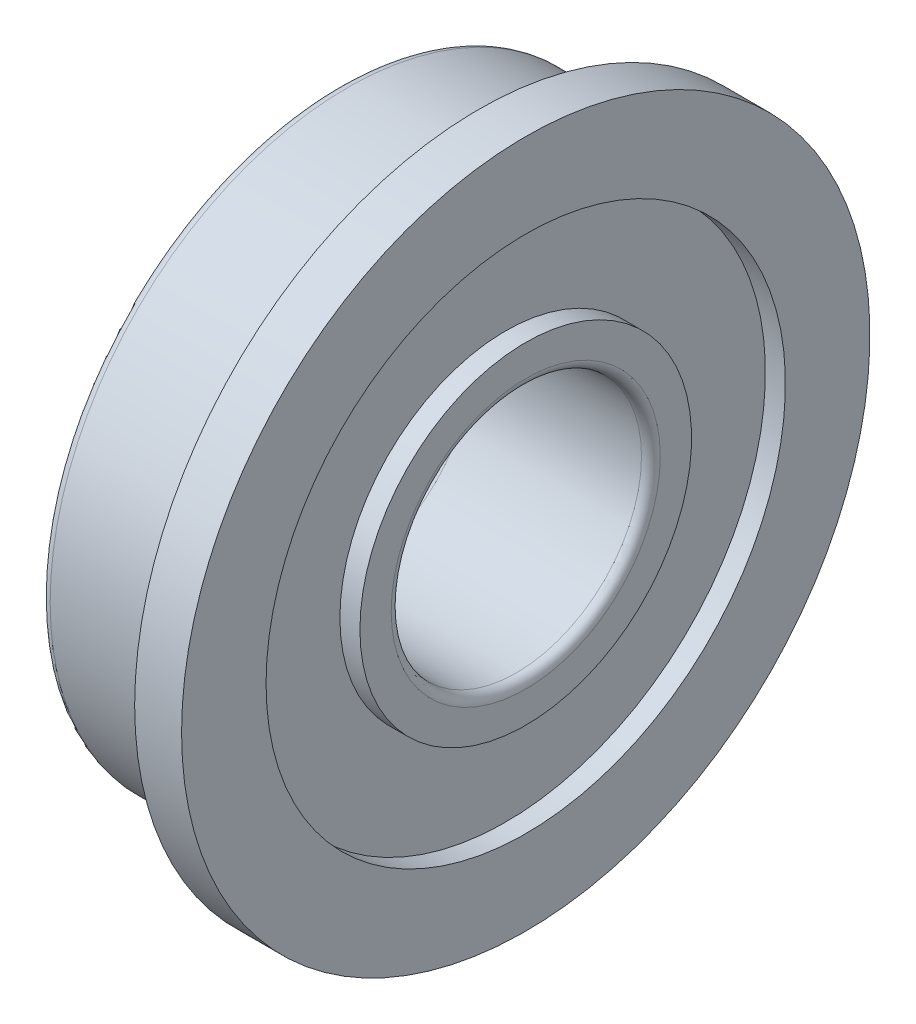
ISO-10303-21;
HEADER;
FILE_DESCRIPTION(('STEP AP214'),'2;1');
FILE_NAME('part.step','',(''),(''),'','','');
FILE_SCHEMA(('AUTOMOTIVE_DESIGN { 1 0 10303 214 1 1 1 1 }'));
ENDSEC;
DATA;
#1=APPLICATION_CONTEXT('core data for automotive mechanical design processes');
#2=APPLICATION_PROTOCOL_DEFINITION('international standard','automotive_design',2000,#1);
#3=PRODUCT_CONTEXT('',#1,'mechanical');
#4=PRODUCT('Part','Part','',(#3));
#5=PRODUCT_RELATED_PRODUCT_CATEGORY('part','',(#4));
#6=PRODUCT_DEFINITION_FORMATION('','',#4);
#7=PRODUCT_DEFINITION_CONTEXT('part definition',#1,'design');
#8=PRODUCT_DEFINITION('design','',#6,#7);
#9=PRODUCT_DEFINITION_SHAPE('','',#8);
#10=(LENGTH_UNIT() NAMED_UNIT(*) SI_UNIT(.MILLI.,.METRE.));
#11=(NAMED_UNIT(*) PLANE_ANGLE_UNIT() SI_UNIT($,.RADIAN.));
#12=(NAMED_UNIT(*) SI_UNIT($,.STERADIAN.) SOLID_ANGLE_UNIT());
#13=UNCERTAINTY_MEASURE_WITH_UNIT(LENGTH_MEASURE(1.E-05),#10,'distance_accuracy_value','');
#14=(GEOMETRIC_REPRESENTATION_CONTEXT(3) GLOBAL_UNCERTAINTY_ASSIGNED_CONTEXT((#13)) GLOBAL_UNIT_ASSIGNED_CONTEXT((#10,
#11,#12)) REPRESENTATION_CONTEXT('',''));
#15=CARTESIAN_POINT('',(0.,0.,0.));
#16=DIRECTION('',(0.,0.,1.));
#17=DIRECTION('',(1.,0.,0.));
#18=AXIS2_PLACEMENT_3D('',#15,#16,#17);
#19=CARTESIAN_POINT('',(0.299999999999936,0.,0.));
#20=DIRECTION('',(-1.,0.,0.));
#21=DIRECTION('',(0.,0.,1.));
#22=AXIS2_PLACEMENT_3D('',#19,#20,#21);
#23=TOROIDAL_SURFACE('',#22,9.20000000000006,0.299999999999936);
#24=CARTESIAN_POINT('',(0.,0.,0.));
#25=DIRECTION('',(-1.,0.,0.));
#26=DIRECTION('',(0.,0.,1.));
#27=AXIS2_PLACEMENT_3D('',#24,#25,#26);
#28=CIRCLE('',#27,9.2);
#29=CARTESIAN_POINT('',(0.,0.,9.2));
#30=VERTEX_POINT('',#29);
#31=EDGE_CURVE('E10',#30,#30,#28,.T.);
#32=ORIENTED_EDGE('',*,*,#31,.F.);
#33=EDGE_LOOP('',(#32));
#34=FACE_BOUND('',#33,.T.);
#35=CARTESIAN_POINT('',(0.300000000000002,0.,0.));
#36=DIRECTION('',(-1.,0.,0.));
#37=DIRECTION('',(0.,0.,1.));
#38=AXIS2_PLACEMENT_3D('',#35,#36,#37);
#39=CIRCLE('',#38,9.5);
#40=CARTESIAN_POINT('',(0.300000000000002,0.,9.5));
#41=VERTEX_POINT('',#40);
#42=EDGE_CURVE('E88',#41,#41,#39,.T.);
#43=ORIENTED_EDGE('',*,*,#42,.T.);
#44=EDGE_LOOP('',(#43));
#45=FACE_BOUND('',#44,.T.);
#46=ADVANCED_FACE('F30',(#34,#45),#23,.T.);
#47=CARTESIAN_POINT('',(0.,9.2,0.));
#48=DIRECTION('',(1.,0.,0.));
#49=DIRECTION('',(0.,0.,-1.));
#50=AXIS2_PLACEMENT_3D('',#47,#48,#49);
#51=PLANE('',#50);
#52=CARTESIAN_POINT('',(0.,0.,0.));
#53=DIRECTION('',(-1.,0.,0.));
#54=DIRECTION('',(0.,0.,1.));
#55=AXIS2_PLACEMENT_3D('',#52,#53,#54);
#56=CIRCLE('',#55,8.3);
#57=CARTESIAN_POINT('',(0.,0.,8.3));
#58=VERTEX_POINT('',#57);
#59=EDGE_CURVE('E36',#58,#58,#56,.T.);
#60=ORIENTED_EDGE('',*,*,#59,.F.);
#61=EDGE_LOOP('',(#60));
#62=FACE_BOUND('',#61,.T.);
#63=ORIENTED_EDGE('',*,*,#31,.T.);
#64=EDGE_LOOP('',(#63));
#65=FACE_BOUND('',#64,.T.);
#66=ADVANCED_FACE('F185',(#62,#65),#51,.F.);
#67=CARTESIAN_POINT('',(19.,0.,0.));
#68=DIRECTION('',(-1.,0.,0.));
#69=DIRECTION('',(0.,0.,1.));
#70=AXIS2_PLACEMENT_3D('',#67,#68,#69);
#71=CYLINDRICAL_SURFACE('',#70,8.3);
#72=CARTESIAN_POINT('',(0.640000000000002,0.,0.));
#73=DIRECTION('',(-1.,0.,0.));
#74=DIRECTION('',(0.,0.,1.));
#75=AXIS2_PLACEMENT_3D('',#72,#73,#74);
#76=CIRCLE('',#75,8.3);
#77=CARTESIAN_POINT('',(0.640000000000002,0.,8.3));
#78=VERTEX_POINT('',#77);
#79=EDGE_CURVE('E40',#78,#78,#76,.T.);
#80=ORIENTED_EDGE('',*,*,#79,.F.);
#81=EDGE_LOOP('',(#80));
#82=FACE_BOUND('',#81,.T.);
#83=ORIENTED_EDGE('',*,*,#59,.T.);
#84=EDGE_LOOP('',(#83));
#85=FACE_BOUND('',#84,.T.);
#86=ADVANCED_FACE('F180',(#82,#85),#71,.F.);
#87=CARTESIAN_POINT('',(0.64,8.3,0.));
#88=DIRECTION('',(1.,0.,0.));
#89=DIRECTION('',(0.,0.,-1.));
#90=AXIS2_PLACEMENT_3D('',#87,#88,#89);
#91=PLANE('',#90);
#92=CARTESIAN_POINT('',(0.640000000000002,0.,0.));
#93=DIRECTION('',(-1.,0.,0.));
#94=DIRECTION('',(0.,0.,1.));
#95=AXIS2_PLACEMENT_3D('',#92,#93,#94);
#96=CIRCLE('',#95,5.3);
#97=CARTESIAN_POINT('',(0.640000000000002,0.,5.3));
#98=VERTEX_POINT('',#97);
#99=EDGE_CURVE('E44',#98,#98,#96,.T.);
#100=ORIENTED_EDGE('',*,*,#99,.F.);
#101=EDGE_LOOP('',(#100));
#102=FACE_BOUND('',#101,.T.);
#103=ORIENTED_EDGE('',*,*,#79,.T.);
#104=EDGE_LOOP('',(#103));
#105=FACE_BOUND('',#104,.T.);
#106=ADVANCED_FACE('F174',(#102,#105),#91,.F.);
#107=CARTESIAN_POINT('',(19.,0.,0.));
#108=DIRECTION('',(-1.,0.,0.));
#109=DIRECTION('',(0.,0.,1.));
#110=AXIS2_PLACEMENT_3D('',#107,#108,#109);
#111=CYLINDRICAL_SURFACE('',#110,5.3);
#112=CARTESIAN_POINT('',(0.,0.,0.));
#113=DIRECTION('',(-1.,0.,0.));
#114=DIRECTION('',(0.,0.,1.));
#115=AXIS2_PLACEMENT_3D('',#112,#113,#114);
#116=CIRCLE('',#115,5.3);
#117=CARTESIAN_POINT('',(0.,0.,5.3));
#118=VERTEX_POINT('',#117);
#119=EDGE_CURVE('E49',#118,#118,#116,.T.);
#120=ORIENTED_EDGE('',*,*,#119,.F.);
#121=EDGE_LOOP('',(#120));
#122=FACE_BOUND('',#121,.T.);
#123=ORIENTED_EDGE('',*,*,#99,.T.);
#124=EDGE_LOOP('',(#123));
#125=FACE_BOUND('',#124,.T.);
#126=ADVANCED_FACE('F168',(#122,#125),#111,.T.);
#127=CARTESIAN_POINT('',(0.,5.3,0.));
#128=DIRECTION('',(1.,0.,0.));
#129=DIRECTION('',(0.,0.,-1.));
#130=AXIS2_PLACEMENT_3D('',#127,#128,#129);
#131=PLANE('',#130);
#132=CARTESIAN_POINT('',(0.,0.,0.));
#133=DIRECTION('',(-1.,0.,0.));
#134=DIRECTION('',(0.,0.,1.));
#135=AXIS2_PLACEMENT_3D('',#132,#133,#134);
#136=CIRCLE('',#135,4.3);
#137=CARTESIAN_POINT('',(0.,0.,4.3));
#138=VERTEX_POINT('',#137);
#139=EDGE_CURVE('E52',#138,#138,#136,.T.);
#140=ORIENTED_EDGE('',*,*,#139,.F.);
#141=EDGE_LOOP('',(#140));
#142=FACE_BOUND('',#141,.T.);
#143=ORIENTED_EDGE('',*,*,#119,.T.);
#144=EDGE_LOOP('',(#143));
#145=FACE_BOUND('',#144,.T.);
#146=ADVANCED_FACE('F162',(#142,#145),#131,.F.);
#147=CARTESIAN_POINT('',(0.299999999999938,0.,0.));
#148=DIRECTION('',(-1.,0.,0.));
#149=DIRECTION('',(0.,0.,1.));
#150=AXIS2_PLACEMENT_3D('',#147,#148,#149);
#151=TOROIDAL_SURFACE('',#150,4.29999999999994,0.299999999999938);
#152=CARTESIAN_POINT('',(0.300000000000002,0.,0.));
#153=DIRECTION('',(-1.,0.,0.));
#154=DIRECTION('',(0.,0.,1.));
#155=AXIS2_PLACEMENT_3D('',#152,#153,#154);
#156=CIRCLE('',#155,4.);
#157=CARTESIAN_POINT('',(0.300000000000002,0.,4.));
#158=VERTEX_POINT('',#157);
#159=EDGE_CURVE('E55',#158,#158,#156,.T.);
#160=ORIENTED_EDGE('',*,*,#159,.F.);
#161=EDGE_LOOP('',(#160));
#162=FACE_BOUND('',#161,.T.);
#163=ORIENTED_EDGE('',*,*,#139,.T.);
#164=EDGE_LOOP('',(#163));
#165=FACE_BOUND('',#164,.T.);
#166=ADVANCED_FACE('F156',(#162,#165),#151,.T.);
#167=CARTESIAN_POINT('',(19.,0.,0.));
#168=DIRECTION('',(-1.,0.,0.));
#169=DIRECTION('',(0.,0.,1.));
#170=AXIS2_PLACEMENT_3D('',#167,#168,#169);
#171=CYLINDRICAL_SURFACE('',#170,4.);
#172=CARTESIAN_POINT('',(5.7,0.,0.));
#173=DIRECTION('',(-1.,0.,0.));
#174=DIRECTION('',(0.,0.,1.));
#175=AXIS2_PLACEMENT_3D('',#172,#173,#174);
#176=CIRCLE('',#175,4.);
#177=CARTESIAN_POINT('',(5.7,0.,4.));
#178=VERTEX_POINT('',#177);
#179=EDGE_CURVE('E58',#178,#178,#176,.T.);
#180=ORIENTED_EDGE('',*,*,#179,.F.);
#181=EDGE_LOOP('',(#180));
#182=FACE_BOUND('',#181,.T.);
#183=ORIENTED_EDGE('',*,*,#159,.T.);
#184=EDGE_LOOP('',(#183));
#185=FACE_BOUND('',#184,.T.);
#186=ADVANCED_FACE('F150',(#182,#185),#171,.F.);
#187=CARTESIAN_POINT('',(5.70000000000012,0.,0.));
#188=DIRECTION('',(-1.,0.,0.));
#189=DIRECTION('',(0.,0.,1.));
#190=AXIS2_PLACEMENT_3D('',#187,#188,#189);
#191=TOROIDAL_SURFACE('',#190,4.29999999999988,0.299999999999877);
#192=CARTESIAN_POINT('',(6.,0.,0.));
#193=DIRECTION('',(-1.,0.,0.));
#194=DIRECTION('',(0.,0.,1.));
#195=AXIS2_PLACEMENT_3D('',#192,#193,#194);
#196=CIRCLE('',#195,4.3);
#197=CARTESIAN_POINT('',(6.,0.,4.3));
#198=VERTEX_POINT('',#197);
#199=EDGE_CURVE('E61',#198,#198,#196,.T.);
#200=ORIENTED_EDGE('',*,*,#199,.F.);
#201=EDGE_LOOP('',(#200));
#202=FACE_BOUND('',#201,.T.);
#203=ORIENTED_EDGE('',*,*,#179,.T.);
#204=EDGE_LOOP('',(#203));
#205=FACE_BOUND('',#204,.T.);
#206=ADVANCED_FACE('F144',(#202,#205),#191,.T.);
#207=CARTESIAN_POINT('',(6.,4.3,0.));
#208=DIRECTION('',(-1.,0.,0.));
#209=DIRECTION('',(0.,0.,1.));
#210=AXIS2_PLACEMENT_3D('',#207,#208,#209);
#211=PLANE('',#210);
#212=CARTESIAN_POINT('',(6.,0.,0.));
#213=DIRECTION('',(-1.,0.,0.));
#214=DIRECTION('',(0.,0.,1.));
#215=AXIS2_PLACEMENT_3D('',#212,#213,#214);
#216=CIRCLE('',#215,5.3);
#217=CARTESIAN_POINT('',(6.,0.,5.3));
#218=VERTEX_POINT('',#217);
#219=EDGE_CURVE('E64',#218,#218,#216,.T.);
#220=ORIENTED_EDGE('',*,*,#219,.F.);
#221=EDGE_LOOP('',(#220));
#222=FACE_BOUND('',#221,.T.);
#223=ORIENTED_EDGE('',*,*,#199,.T.);
#224=EDGE_LOOP('',(#223));
#225=FACE_BOUND('',#224,.T.);
#226=ADVANCED_FACE('F138',(#222,#225),#211,.F.);
#227=CARTESIAN_POINT('',(19.,0.,0.));
#228=DIRECTION('',(-1.,0.,0.));
#229=DIRECTION('',(0.,0.,1.));
#230=AXIS2_PLACEMENT_3D('',#227,#228,#229);
#231=CYLINDRICAL_SURFACE('',#230,5.3);
#232=CARTESIAN_POINT('',(5.36,0.,0.));
#233=DIRECTION('',(-1.,0.,0.));
#234=DIRECTION('',(0.,0.,1.));
#235=AXIS2_PLACEMENT_3D('',#232,#233,#234);
#236=CIRCLE('',#235,5.3);
#237=CARTESIAN_POINT('',(5.36,0.,5.3));
#238=VERTEX_POINT('',#237);
#239=EDGE_CURVE('E67',#238,#238,#236,.T.);
#240=ORIENTED_EDGE('',*,*,#239,.F.);
#241=EDGE_LOOP('',(#240));
#242=FACE_BOUND('',#241,.T.);
#243=ORIENTED_EDGE('',*,*,#219,.T.);
#244=EDGE_LOOP('',(#243));
#245=FACE_BOUND('',#244,.T.);
#246=ADVANCED_FACE('F132',(#242,#245),#231,.T.);
#247=CARTESIAN_POINT('',(5.36,5.3,0.));
#248=DIRECTION('',(-1.,0.,0.));
#249=DIRECTION('',(0.,0.,1.));
#250=AXIS2_PLACEMENT_3D('',#247,#248,#249);
#251=PLANE('',#250);
#252=CARTESIAN_POINT('',(5.36,0.,0.));
#253=DIRECTION('',(-1.,0.,0.));
#254=DIRECTION('',(0.,0.,1.));
#255=AXIS2_PLACEMENT_3D('',#252,#253,#254);
#256=CIRCLE('',#255,8.3);
#257=CARTESIAN_POINT('',(5.36,0.,8.3));
#258=VERTEX_POINT('',#257);
#259=EDGE_CURVE('E70',#258,#258,#256,.T.);
#260=ORIENTED_EDGE('',*,*,#259,.F.);
#261=EDGE_LOOP('',(#260));
#262=FACE_BOUND('',#261,.T.);
#263=ORIENTED_EDGE('',*,*,#239,.T.);
#264=EDGE_LOOP('',(#263));
#265=FACE_BOUND('',#264,.T.);
#266=ADVANCED_FACE('F126',(#262,#265),#251,.F.);
#267=CARTESIAN_POINT('',(19.,0.,0.));
#268=DIRECTION('',(-1.,0.,0.));
#269=DIRECTION('',(0.,0.,1.));
#270=AXIS2_PLACEMENT_3D('',#267,#268,#269);
#271=CYLINDRICAL_SURFACE('',#270,8.3);
#272=CARTESIAN_POINT('',(6.,0.,0.));
#273=DIRECTION('',(-1.,0.,0.));
#274=DIRECTION('',(0.,0.,1.));
#275=AXIS2_PLACEMENT_3D('',#272,#273,#274);
#276=CIRCLE('',#275,8.3);
#277=CARTESIAN_POINT('',(6.,0.,8.3));
#278=VERTEX_POINT('',#277);
#279=EDGE_CURVE('E73',#278,#278,#276,.T.);
#280=ORIENTED_EDGE('',*,*,#279,.F.);
#281=EDGE_LOOP('',(#280));
#282=FACE_BOUND('',#281,.T.);
#283=ORIENTED_EDGE('',*,*,#259,.T.);
#284=EDGE_LOOP('',(#283));
#285=FACE_BOUND('',#284,.T.);
#286=ADVANCED_FACE('F120',(#282,#285),#271,.F.);
#287=CARTESIAN_POINT('',(6.,8.3,0.));
#288=DIRECTION('',(-1.,0.,0.));
#289=DIRECTION('',(0.,0.,1.));
#290=AXIS2_PLACEMENT_3D('',#287,#288,#289);
#291=PLANE('',#290);
#292=CARTESIAN_POINT('',(6.,0.,0.));
#293=DIRECTION('',(-1.,0.,0.));
#294=DIRECTION('',(0.,0.,1.));
#295=AXIS2_PLACEMENT_3D('',#292,#293,#294);
#296=CIRCLE('',#295,11.);
#297=CARTESIAN_POINT('',(6.,0.,11.));
#298=VERTEX_POINT('',#297);
#299=EDGE_CURVE('E76',#298,#298,#296,.T.);
#300=ORIENTED_EDGE('',*,*,#299,.F.);
#301=EDGE_LOOP('',(#300));
#302=FACE_BOUND('',#301,.T.);
#303=ORIENTED_EDGE('',*,*,#279,.T.);
#304=EDGE_LOOP('',(#303));
#305=FACE_BOUND('',#304,.T.);
#306=ADVANCED_FACE('F114',(#302,#305),#291,.F.);
#307=CARTESIAN_POINT('',(19.,0.,0.));
#308=DIRECTION('',(-1.,0.,0.));
#309=DIRECTION('',(0.,0.,1.));
#310=AXIS2_PLACEMENT_3D('',#307,#308,#309);
#311=CYLINDRICAL_SURFACE('',#310,11.);
#312=CARTESIAN_POINT('',(4.5,0.,0.));
#313=DIRECTION('',(-1.,0.,0.));
#314=DIRECTION('',(0.,0.,1.));
#315=AXIS2_PLACEMENT_3D('',#312,#313,#314);
#316=CIRCLE('',#315,11.);
#317=CARTESIAN_POINT('',(4.5,0.,11.));
#318=VERTEX_POINT('',#317);
#319=EDGE_CURVE('E79',#318,#318,#316,.T.);
#320=ORIENTED_EDGE('',*,*,#319,.F.);
#321=EDGE_LOOP('',(#320));
#322=FACE_BOUND('',#321,.T.);
#323=ORIENTED_EDGE('',*,*,#299,.T.);
#324=EDGE_LOOP('',(#323));
#325=FACE_BOUND('',#324,.T.);
#326=ADVANCED_FACE('F108',(#322,#325),#311,.T.);
#327=CARTESIAN_POINT('',(4.5,11.,0.));
#328=DIRECTION('',(1.,0.,0.));
#329=DIRECTION('',(0.,0.,-1.));
#330=AXIS2_PLACEMENT_3D('',#327,#328,#329);
#331=PLANE('',#330);
#332=CARTESIAN_POINT('',(4.5,0.,0.));
#333=DIRECTION('',(-1.,0.,0.));
#334=DIRECTION('',(0.,0.,1.));
#335=AXIS2_PLACEMENT_3D('',#332,#333,#334);
#336=CIRCLE('',#335,9.8);
#337=CARTESIAN_POINT('',(4.5,0.,9.8));
#338=VERTEX_POINT('',#337);
#339=EDGE_CURVE('E82',#338,#338,#336,.T.);
#340=ORIENTED_EDGE('',*,*,#339,.F.);
#341=EDGE_LOOP('',(#340));
#342=FACE_BOUND('',#341,.T.);
#343=ORIENTED_EDGE('',*,*,#319,.T.);
#344=EDGE_LOOP('',(#343));
#345=FACE_BOUND('',#344,.T.);
#346=ADVANCED_FACE('F102',(#342,#345),#331,.F.);
#347=CARTESIAN_POINT('',(4.50000000000002,0.,0.));
#348=DIRECTION('',(-1.,0.,0.));
#349=DIRECTION('',(0.,0.,1.));
#350=AXIS2_PLACEMENT_3D('',#347,#348,#349);
#351=TOROIDAL_SURFACE('',#350,9.49999999999998,0.30000000000002);
#352=CARTESIAN_POINT('',(4.2,0.,0.));
#353=DIRECTION('',(-1.,0.,0.));
#354=DIRECTION('',(0.,0.,1.));
#355=AXIS2_PLACEMENT_3D('',#352,#353,#354);
#356=CIRCLE('',#355,9.5);
#357=CARTESIAN_POINT('',(4.2,0.,9.5));
#358=VERTEX_POINT('',#357);
#359=EDGE_CURVE('E85',#358,#358,#356,.T.);
#360=ORIENTED_EDGE('',*,*,#359,.F.);
#361=EDGE_LOOP('',(#360));
#362=FACE_BOUND('',#361,.T.);
#363=ORIENTED_EDGE('',*,*,#339,.T.);
#364=EDGE_LOOP('',(#363));
#365=FACE_BOUND('',#364,.T.);
#366=ADVANCED_FACE('F96',(#362,#365),#351,.F.);
#367=CARTESIAN_POINT('',(19.,0.,0.));
#368=DIRECTION('',(-1.,0.,0.));
#369=DIRECTION('',(0.,0.,1.));
#370=AXIS2_PLACEMENT_3D('',#367,#368,#369);
#371=CYLINDRICAL_SURFACE('',#370,9.5);
#372=ORIENTED_EDGE('',*,*,#42,.F.);
#373=EDGE_LOOP('',(#372));
#374=FACE_BOUND('',#373,.T.);
#375=ORIENTED_EDGE('',*,*,#359,.T.);
#376=EDGE_LOOP('',(#375));
#377=FACE_BOUND('',#376,.T.);
#378=ADVANCED_FACE('F93',(#374,#377),#371,.T.);
#379=CLOSED_SHELL('',(#46,#66,#86,#106,#126,#146,#166,#186,#206,#226,#246,#266,#286,#306,#326,
#346,#366,#378));
#380=MANIFOLD_SOLID_BREP('B2',#379);
#381=ADVANCED_BREP_SHAPE_REPRESENTATION('',(#18,#380),#14);
#382=SHAPE_DEFINITION_REPRESENTATION(#9,#381);
ENDSEC;
END-ISO-10303-21;
